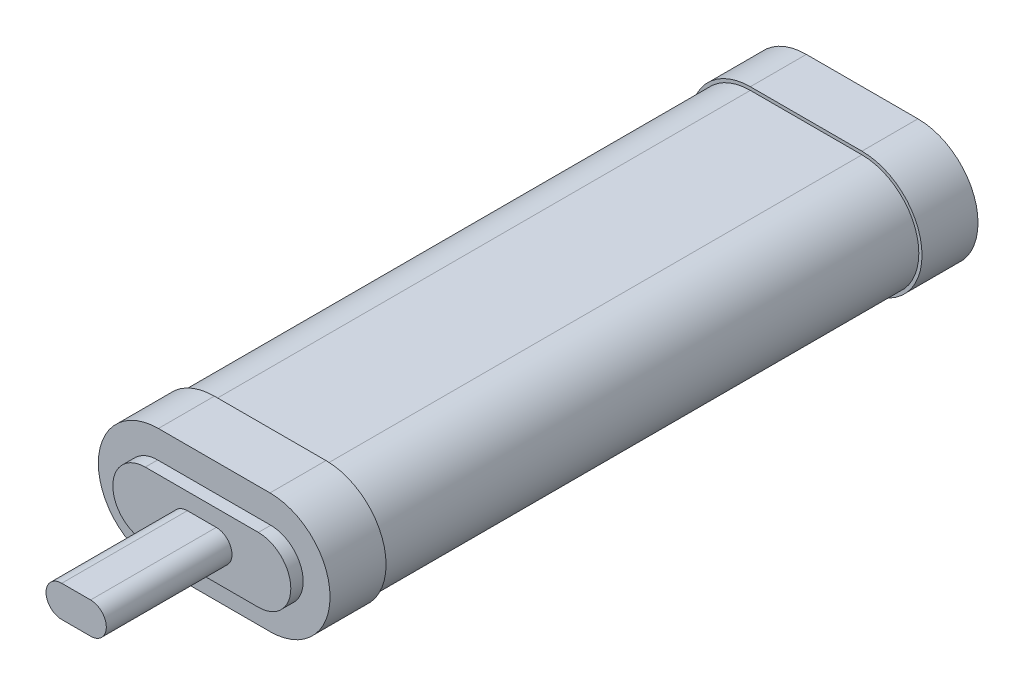
ISO-10303-21;
HEADER;
FILE_DESCRIPTION(('STEP AP214'),'2;1');
FILE_NAME('part.step','',(''),(''),'','','');
FILE_SCHEMA(('AUTOMOTIVE_DESIGN { 1 0 10303 214 1 1 1 1 }'));
ENDSEC;
DATA;
#1=APPLICATION_CONTEXT('core data for automotive mechanical design processes');
#2=APPLICATION_PROTOCOL_DEFINITION('international standard','automotive_design',2000,#1);
#3=PRODUCT_CONTEXT('',#1,'mechanical');
#4=PRODUCT('Part','Part','',(#3));
#5=PRODUCT_RELATED_PRODUCT_CATEGORY('part','',(#4));
#6=PRODUCT_DEFINITION_FORMATION('','',#4);
#7=PRODUCT_DEFINITION_CONTEXT('part definition',#1,'design');
#8=PRODUCT_DEFINITION('design','',#6,#7);
#9=PRODUCT_DEFINITION_SHAPE('','',#8);
#10=(LENGTH_UNIT() NAMED_UNIT(*) SI_UNIT(.MILLI.,.METRE.));
#11=(NAMED_UNIT(*) PLANE_ANGLE_UNIT() SI_UNIT($,.RADIAN.));
#12=(NAMED_UNIT(*) SI_UNIT($,.STERADIAN.) SOLID_ANGLE_UNIT());
#13=UNCERTAINTY_MEASURE_WITH_UNIT(LENGTH_MEASURE(1.E-05),#10,'distance_accuracy_value','');
#14=(GEOMETRIC_REPRESENTATION_CONTEXT(3) GLOBAL_UNCERTAINTY_ASSIGNED_CONTEXT((#13)) GLOBAL_UNIT_ASSIGNED_CONTEXT((#10,
#11,#12)) REPRESENTATION_CONTEXT('',''));
#15=CARTESIAN_POINT('',(0.,0.,0.));
#16=DIRECTION('',(0.,0.,1.));
#17=DIRECTION('',(1.,0.,0.));
#18=AXIS2_PLACEMENT_3D('',#15,#16,#17);
#19=CARTESIAN_POINT('',(-11.1,0.,64.45));
#20=DIRECTION('',(0.,0.,-1.));
#21=DIRECTION('',(-1.,0.,0.));
#22=AXIS2_PLACEMENT_3D('',#19,#20,#21);
#23=CYLINDRICAL_SURFACE('',#22,11.315);
#24=CARTESIAN_POINT('',(-11.1,0.,-53.31));
#25=DIRECTION('',(0.,0.,-1.));
#26=DIRECTION('',(-1.,0.,0.));
#27=AXIS2_PLACEMENT_3D('',#24,#25,#26);
#28=CIRCLE('',#27,11.315);
#29=CARTESIAN_POINT('',(-11.1,-11.315,-53.31));
#30=VERTEX_POINT('',#29);
#31=CARTESIAN_POINT('',(-11.1,11.315,-53.31));
#32=VERTEX_POINT('',#31);
#33=EDGE_CURVE('E267',#30,#32,#28,.T.);
#34=ORIENTED_EDGE('',*,*,#33,.F.);
#35=DIRECTION('',(0.,0.,-1.));
#36=VECTOR('',#35,1.);
#37=CARTESIAN_POINT('',(-11.1,-11.315,64.45));
#38=LINE('',#37,#36);
#39=CARTESIAN_POINT('',(-11.1,-11.315,53.31));
#40=VERTEX_POINT('',#39);
#41=EDGE_CURVE('E319',#40,#30,#38,.T.);
#42=ORIENTED_EDGE('',*,*,#41,.F.);
#43=CARTESIAN_POINT('',(-11.1,0.,53.31));
#44=DIRECTION('',(0.,0.,1.));
#45=DIRECTION('',(1.,0.,0.));
#46=AXIS2_PLACEMENT_3D('',#43,#44,#45);
#47=CIRCLE('',#46,11.315);
#48=CARTESIAN_POINT('',(-11.1,11.315,53.31));
#49=VERTEX_POINT('',#48);
#50=EDGE_CURVE('E308',#49,#40,#47,.T.);
#51=ORIENTED_EDGE('',*,*,#50,.F.);
#52=DIRECTION('',(0.,0.,-1.));
#53=VECTOR('',#52,1.);
#54=CARTESIAN_POINT('',(-11.1,11.315,64.45));
#55=LINE('',#54,#53);
#56=EDGE_CURVE('E311',#49,#32,#55,.T.);
#57=ORIENTED_EDGE('',*,*,#56,.T.);
#58=EDGE_LOOP('',(#34,#42,#51,#57));
#59=FACE_BOUND('',#58,.T.);
#60=ADVANCED_FACE('F34',(#59),#23,.T.);
#61=CARTESIAN_POINT('',(-11.1,-11.315,64.45));
#62=DIRECTION('',(0.,1.,0.));
#63=DIRECTION('',(-1.,0.,0.));
#64=AXIS2_PLACEMENT_3D('',#61,#62,#63);
#65=PLANE('',#64);
#66=DIRECTION('',(-1.,0.,0.));
#67=VECTOR('',#66,1.);
#68=CARTESIAN_POINT('',(-11.1,-11.315,-53.31));
#69=LINE('',#68,#67);
#70=CARTESIAN_POINT('',(11.1,-11.315,-53.31));
#71=VERTEX_POINT('',#70);
#72=EDGE_CURVE('E264',#71,#30,#69,.T.);
#73=ORIENTED_EDGE('',*,*,#72,.F.);
#74=DIRECTION('',(0.,0.,-1.));
#75=VECTOR('',#74,1.);
#76=CARTESIAN_POINT('',(11.1,-11.315,64.45));
#77=LINE('',#76,#75);
#78=CARTESIAN_POINT('',(11.1,-11.315,53.31));
#79=VERTEX_POINT('',#78);
#80=EDGE_CURVE('E316',#79,#71,#77,.T.);
#81=ORIENTED_EDGE('',*,*,#80,.F.);
#82=DIRECTION('',(1.,0.,0.));
#83=VECTOR('',#82,1.);
#84=CARTESIAN_POINT('',(-11.1,-11.315,53.31));
#85=LINE('',#84,#83);
#86=EDGE_CURVE('E305',#40,#79,#85,.T.);
#87=ORIENTED_EDGE('',*,*,#86,.F.);
#88=ORIENTED_EDGE('',*,*,#41,.T.);
#89=EDGE_LOOP('',(#73,#81,#87,#88));
#90=FACE_BOUND('',#89,.T.);
#91=ADVANCED_FACE('F337',(#90),#65,.F.);
#92=CARTESIAN_POINT('',(11.1,0.,64.45));
#93=DIRECTION('',(0.,0.,-1.));
#94=DIRECTION('',(-1.,0.,0.));
#95=AXIS2_PLACEMENT_3D('',#92,#93,#94);
#96=CYLINDRICAL_SURFACE('',#95,11.315);
#97=CARTESIAN_POINT('',(11.1,0.,-53.31));
#98=DIRECTION('',(0.,0.,-1.));
#99=DIRECTION('',(-1.,0.,0.));
#100=AXIS2_PLACEMENT_3D('',#97,#98,#99);
#101=CIRCLE('',#100,11.315);
#102=CARTESIAN_POINT('',(11.1,11.315,-53.31));
#103=VERTEX_POINT('',#102);
#104=EDGE_CURVE('E253',#103,#71,#101,.T.);
#105=ORIENTED_EDGE('',*,*,#104,.F.);
#106=DIRECTION('',(0.,0.,-1.));
#107=VECTOR('',#106,1.);
#108=CARTESIAN_POINT('',(11.1,11.315,64.45));
#109=LINE('',#108,#107);
#110=CARTESIAN_POINT('',(11.1,11.315,53.31));
#111=VERTEX_POINT('',#110);
#112=EDGE_CURVE('E314',#111,#103,#109,.T.);
#113=ORIENTED_EDGE('',*,*,#112,.F.);
#114=CARTESIAN_POINT('',(11.1,0.,53.31));
#115=DIRECTION('',(0.,0.,1.));
#116=DIRECTION('',(1.,0.,0.));
#117=AXIS2_PLACEMENT_3D('',#114,#115,#116);
#118=CIRCLE('',#117,11.315);
#119=EDGE_CURVE('E297',#79,#111,#118,.T.);
#120=ORIENTED_EDGE('',*,*,#119,.F.);
#121=ORIENTED_EDGE('',*,*,#80,.T.);
#122=EDGE_LOOP('',(#105,#113,#120,#121));
#123=FACE_BOUND('',#122,.T.);
#124=ADVANCED_FACE('F330',(#123),#96,.T.);
#125=CARTESIAN_POINT('',(-11.1,11.315,64.45));
#126=DIRECTION('',(0.,-1.,0.));
#127=DIRECTION('',(1.,0.,0.));
#128=AXIS2_PLACEMENT_3D('',#125,#126,#127);
#129=PLANE('',#128);
#130=DIRECTION('',(1.,0.,0.));
#131=VECTOR('',#130,1.);
#132=CARTESIAN_POINT('',(-11.1,11.315,-53.31));
#133=LINE('',#132,#131);
#134=EDGE_CURVE('E12',#32,#103,#133,.T.);
#135=ORIENTED_EDGE('',*,*,#134,.F.);
#136=ORIENTED_EDGE('',*,*,#56,.F.);
#137=DIRECTION('',(-1.,0.,0.));
#138=VECTOR('',#137,1.);
#139=CARTESIAN_POINT('',(-11.1,11.315,53.31));
#140=LINE('',#139,#138);
#141=EDGE_CURVE('E41',#111,#49,#140,.T.);
#142=ORIENTED_EDGE('',*,*,#141,.F.);
#143=ORIENTED_EDGE('',*,*,#112,.T.);
#144=EDGE_LOOP('',(#135,#136,#142,#143));
#145=FACE_BOUND('',#144,.T.);
#146=ADVANCED_FACE('F327',(#145),#129,.F.);
#147=CARTESIAN_POINT('',(-11.1,0.,53.31));
#148=DIRECTION('',(0.,0.,1.));
#149=DIRECTION('',(1.,0.,0.));
#150=AXIS2_PLACEMENT_3D('',#147,#148,#149);
#151=PLANE('',#150);
#152=CARTESIAN_POINT('',(-11.1,0.,53.31));
#153=DIRECTION('',(0.,0.,1.));
#154=DIRECTION('',(1.,0.,0.));
#155=AXIS2_PLACEMENT_3D('',#152,#153,#154);
#156=CIRCLE('',#155,11.95);
#157=CARTESIAN_POINT('',(-11.1,11.95,53.31));
#158=VERTEX_POINT('',#157);
#159=CARTESIAN_POINT('',(-11.1,-11.95,53.31));
#160=VERTEX_POINT('',#159);
#161=EDGE_CURVE('E271',#158,#160,#156,.T.);
#162=ORIENTED_EDGE('',*,*,#161,.F.);
#163=DIRECTION('',(-1.,0.,0.));
#164=VECTOR('',#163,1.);
#165=CARTESIAN_POINT('',(11.1,11.95,53.31));
#166=LINE('',#165,#164);
#167=CARTESIAN_POINT('',(11.1,11.95,53.31));
#168=VERTEX_POINT('',#167);
#169=EDGE_CURVE('E281',#168,#158,#166,.T.);
#170=ORIENTED_EDGE('',*,*,#169,.F.);
#171=CARTESIAN_POINT('',(11.1,0.,53.31));
#172=DIRECTION('',(0.,0.,1.));
#173=DIRECTION('',(1.,0.,0.));
#174=AXIS2_PLACEMENT_3D('',#171,#172,#173);
#175=CIRCLE('',#174,11.95);
#176=CARTESIAN_POINT('',(11.1,-11.95,53.31));
#177=VERTEX_POINT('',#176);
#178=EDGE_CURVE('E278',#177,#168,#175,.T.);
#179=ORIENTED_EDGE('',*,*,#178,.F.);
#180=DIRECTION('',(1.,0.,0.));
#181=VECTOR('',#180,1.);
#182=CARTESIAN_POINT('',(-11.1,-11.95,53.31));
#183=LINE('',#182,#181);
#184=EDGE_CURVE('E274',#160,#177,#183,.T.);
#185=ORIENTED_EDGE('',*,*,#184,.F.);
#186=EDGE_LOOP('',(#162,#170,#179,#185));
#187=FACE_BOUND('',#186,.T.);
#188=ORIENTED_EDGE('',*,*,#141,.T.);
#189=ORIENTED_EDGE('',*,*,#50,.T.);
#190=ORIENTED_EDGE('',*,*,#86,.T.);
#191=ORIENTED_EDGE('',*,*,#119,.T.);
#192=EDGE_LOOP('',(#188,#189,#190,#191));
#193=FACE_BOUND('',#192,.T.);
#194=ADVANCED_FACE('F323',(#187,#193),#151,.F.);
#195=CARTESIAN_POINT('',(-11.1,0.,53.31));
#196=DIRECTION('',(0.,0.,1.));
#197=DIRECTION('',(1.,0.,0.));
#198=AXIS2_PLACEMENT_3D('',#195,#196,#197);
#199=CYLINDRICAL_SURFACE('',#198,11.95);
#200=CARTESIAN_POINT('',(-11.1,0.,64.45));
#201=DIRECTION('',(0.,0.,1.));
#202=DIRECTION('',(1.,0.,0.));
#203=AXIS2_PLACEMENT_3D('',#200,#201,#202);
#204=CIRCLE('',#203,11.95);
#205=CARTESIAN_POINT('',(-11.1,11.95,64.45));
#206=VERTEX_POINT('',#205);
#207=CARTESIAN_POINT('',(-11.1,-11.95,64.45));
#208=VERTEX_POINT('',#207);
#209=EDGE_CURVE('E270',#206,#208,#204,.T.);
#210=ORIENTED_EDGE('',*,*,#209,.F.);
#211=DIRECTION('',(0.,0.,1.));
#212=VECTOR('',#211,1.);
#213=CARTESIAN_POINT('',(-11.1,11.95,53.31));
#214=LINE('',#213,#212);
#215=EDGE_CURVE('E295',#158,#206,#214,.T.);
#216=ORIENTED_EDGE('',*,*,#215,.F.);
#217=ORIENTED_EDGE('',*,*,#161,.T.);
#218=DIRECTION('',(0.,0.,1.));
#219=VECTOR('',#218,1.);
#220=CARTESIAN_POINT('',(-11.1,-11.95,53.31));
#221=LINE('',#220,#219);
#222=EDGE_CURVE('E284',#160,#208,#221,.T.);
#223=ORIENTED_EDGE('',*,*,#222,.T.);
#224=EDGE_LOOP('',(#210,#216,#217,#223));
#225=FACE_BOUND('',#224,.T.);
#226=ADVANCED_FACE('F358',(#225),#199,.T.);
#227=CARTESIAN_POINT('',(11.1,11.95,53.31));
#228=DIRECTION('',(0.,1.,0.));
#229=DIRECTION('',(-1.,0.,0.));
#230=AXIS2_PLACEMENT_3D('',#227,#228,#229);
#231=PLANE('',#230);
#232=DIRECTION('',(-1.,0.,0.));
#233=VECTOR('',#232,1.);
#234=CARTESIAN_POINT('',(11.1,11.95,64.45));
#235=LINE('',#234,#233);
#236=CARTESIAN_POINT('',(11.1,11.95,64.45));
#237=VERTEX_POINT('',#236);
#238=EDGE_CURVE('E275',#237,#206,#235,.T.);
#239=ORIENTED_EDGE('',*,*,#238,.F.);
#240=DIRECTION('',(0.,0.,1.));
#241=VECTOR('',#240,1.);
#242=CARTESIAN_POINT('',(11.1,11.95,53.31));
#243=LINE('',#242,#241);
#244=EDGE_CURVE('E298',#168,#237,#243,.T.);
#245=ORIENTED_EDGE('',*,*,#244,.F.);
#246=ORIENTED_EDGE('',*,*,#169,.T.);
#247=ORIENTED_EDGE('',*,*,#215,.T.);
#248=EDGE_LOOP('',(#239,#245,#246,#247));
#249=FACE_BOUND('',#248,.T.);
#250=ADVANCED_FACE('F361',(#249),#231,.T.);
#251=CARTESIAN_POINT('',(11.1,0.,53.31));
#252=DIRECTION('',(0.,0.,1.));
#253=DIRECTION('',(1.,0.,0.));
#254=AXIS2_PLACEMENT_3D('',#251,#252,#253);
#255=CYLINDRICAL_SURFACE('',#254,11.95);
#256=CARTESIAN_POINT('',(11.1,0.,64.45));
#257=DIRECTION('',(0.,0.,1.));
#258=DIRECTION('',(1.,0.,0.));
#259=AXIS2_PLACEMENT_3D('',#256,#257,#258);
#260=CIRCLE('',#259,11.95);
#261=CARTESIAN_POINT('',(11.1,-11.95,64.45));
#262=VERTEX_POINT('',#261);
#263=EDGE_CURVE('E290',#262,#237,#260,.T.);
#264=ORIENTED_EDGE('',*,*,#263,.F.);
#265=DIRECTION('',(0.,0.,1.));
#266=VECTOR('',#265,1.);
#267=CARTESIAN_POINT('',(11.1,-11.95,53.31));
#268=LINE('',#267,#266);
#269=EDGE_CURVE('E300',#177,#262,#268,.T.);
#270=ORIENTED_EDGE('',*,*,#269,.F.);
#271=ORIENTED_EDGE('',*,*,#178,.T.);
#272=ORIENTED_EDGE('',*,*,#244,.T.);
#273=EDGE_LOOP('',(#264,#270,#271,#272));
#274=FACE_BOUND('',#273,.T.);
#275=ADVANCED_FACE('F365',(#274),#255,.T.);
#276=CARTESIAN_POINT('',(-11.1,-11.95,53.31));
#277=DIRECTION('',(0.,-1.,0.));
#278=DIRECTION('',(1.,0.,0.));
#279=AXIS2_PLACEMENT_3D('',#276,#277,#278);
#280=PLANE('',#279);
#281=DIRECTION('',(1.,0.,0.));
#282=VECTOR('',#281,1.);
#283=CARTESIAN_POINT('',(-11.1,-11.95,64.45));
#284=LINE('',#283,#282);
#285=EDGE_CURVE('E287',#208,#262,#284,.T.);
#286=ORIENTED_EDGE('',*,*,#285,.F.);
#287=ORIENTED_EDGE('',*,*,#222,.F.);
#288=ORIENTED_EDGE('',*,*,#184,.T.);
#289=ORIENTED_EDGE('',*,*,#269,.T.);
#290=EDGE_LOOP('',(#286,#287,#288,#289));
#291=FACE_BOUND('',#290,.T.);
#292=ADVANCED_FACE('F356',(#291),#280,.T.);
#293=CARTESIAN_POINT('',(-11.1,0.,64.45));
#294=DIRECTION('',(0.,0.,1.));
#295=DIRECTION('',(1.,0.,0.));
#296=AXIS2_PLACEMENT_3D('',#293,#294,#295);
#297=PLANE('',#296);
#298=CARTESIAN_POINT('',(-11.25,0.,64.45));
#299=DIRECTION('',(0.,0.,1.));
#300=DIRECTION('',(1.,0.,0.));
#301=AXIS2_PLACEMENT_3D('',#298,#299,#300);
#302=CIRCLE('',#301,6.45);
#303=CARTESIAN_POINT('',(-11.25,6.45,64.45));
#304=VERTEX_POINT('',#303);
#305=CARTESIAN_POINT('',(-11.25,-6.45,64.45));
#306=VERTEX_POINT('',#305);
#307=EDGE_CURVE('E193',#304,#306,#302,.T.);
#308=ORIENTED_EDGE('',*,*,#307,.F.);
#309=DIRECTION('',(-1.,0.,0.));
#310=VECTOR('',#309,1.);
#311=CARTESIAN_POINT('',(-11.25,6.45,64.45));
#312=LINE('',#311,#310);
#313=CARTESIAN_POINT('',(11.25,6.45,64.45));
#314=VERTEX_POINT('',#313);
#315=EDGE_CURVE('E199',#314,#304,#312,.T.);
#316=ORIENTED_EDGE('',*,*,#315,.F.);
#317=CARTESIAN_POINT('',(11.25,0.,64.45));
#318=DIRECTION('',(0.,0.,1.));
#319=DIRECTION('',(1.,0.,0.));
#320=AXIS2_PLACEMENT_3D('',#317,#318,#319);
#321=CIRCLE('',#320,6.45);
#322=CARTESIAN_POINT('',(11.25,-6.45,64.45));
#323=VERTEX_POINT('',#322);
#324=EDGE_CURVE('E204',#323,#314,#321,.T.);
#325=ORIENTED_EDGE('',*,*,#324,.F.);
#326=DIRECTION('',(1.,0.,0.));
#327=VECTOR('',#326,1.);
#328=CARTESIAN_POINT('',(-11.25,-6.45,64.45));
#329=LINE('',#328,#327);
#330=EDGE_CURVE('E208',#306,#323,#329,.T.);
#331=ORIENTED_EDGE('',*,*,#330,.F.);
#332=EDGE_LOOP('',(#308,#316,#325,#331));
#333=FACE_BOUND('',#332,.T.);
#334=ORIENTED_EDGE('',*,*,#209,.T.);
#335=ORIENTED_EDGE('',*,*,#285,.T.);
#336=ORIENTED_EDGE('',*,*,#263,.T.);
#337=ORIENTED_EDGE('',*,*,#238,.T.);
#338=EDGE_LOOP('',(#334,#335,#336,#337));
#339=FACE_BOUND('',#338,.T.);
#340=ADVANCED_FACE('F353',(#333,#339),#297,.T.);
#341=CARTESIAN_POINT('',(-11.1,0.,-53.31));
#342=DIRECTION('',(0.,0.,-1.));
#343=DIRECTION('',(1.,0.,0.));
#344=AXIS2_PLACEMENT_3D('',#341,#342,#343);
#345=PLANE('',#344);
#346=CARTESIAN_POINT('',(-11.1,0.,-53.31));
#347=DIRECTION('',(0.,0.,1.));
#348=DIRECTION('',(1.,0.,0.));
#349=AXIS2_PLACEMENT_3D('',#346,#347,#348);
#350=CIRCLE('',#349,11.95);
#351=CARTESIAN_POINT('',(-11.1,11.95,-53.31));
#352=VERTEX_POINT('',#351);
#353=CARTESIAN_POINT('',(-11.1,-11.95,-53.31));
#354=VERTEX_POINT('',#353);
#355=EDGE_CURVE('E232',#352,#354,#350,.T.);
#356=ORIENTED_EDGE('',*,*,#355,.T.);
#357=DIRECTION('',(1.,0.,0.));
#358=VECTOR('',#357,1.);
#359=CARTESIAN_POINT('',(-11.1,-11.95,-53.31));
#360=LINE('',#359,#358);
#361=CARTESIAN_POINT('',(11.1,-11.95,-53.31));
#362=VERTEX_POINT('',#361);
#363=EDGE_CURVE('E240',#354,#362,#360,.T.);
#364=ORIENTED_EDGE('',*,*,#363,.T.);
#365=CARTESIAN_POINT('',(11.1,0.,-53.31));
#366=DIRECTION('',(0.,0.,1.));
#367=DIRECTION('',(1.,0.,0.));
#368=AXIS2_PLACEMENT_3D('',#365,#366,#367);
#369=CIRCLE('',#368,11.95);
#370=CARTESIAN_POINT('',(11.1,11.95,-53.31));
#371=VERTEX_POINT('',#370);
#372=EDGE_CURVE('E238',#362,#371,#369,.T.);
#373=ORIENTED_EDGE('',*,*,#372,.T.);
#374=DIRECTION('',(-1.,0.,0.));
#375=VECTOR('',#374,1.);
#376=CARTESIAN_POINT('',(11.1,11.95,-53.31));
#377=LINE('',#376,#375);
#378=EDGE_CURVE('E235',#371,#352,#377,.T.);
#379=ORIENTED_EDGE('',*,*,#378,.T.);
#380=EDGE_LOOP('',(#356,#364,#373,#379));
#381=FACE_BOUND('',#380,.T.);
#382=ORIENTED_EDGE('',*,*,#72,.T.);
#383=ORIENTED_EDGE('',*,*,#33,.T.);
#384=ORIENTED_EDGE('',*,*,#134,.T.);
#385=ORIENTED_EDGE('',*,*,#104,.T.);
#386=EDGE_LOOP('',(#382,#383,#384,#385));
#387=FACE_BOUND('',#386,.T.);
#388=ADVANCED_FACE('F333',(#381,#387),#345,.F.);
#389=CARTESIAN_POINT('',(-11.1,0.,-53.31));
#390=DIRECTION('',(0.,0.,-1.));
#391=DIRECTION('',(-1.,0.,0.));
#392=AXIS2_PLACEMENT_3D('',#389,#390,#391);
#393=CYLINDRICAL_SURFACE('',#392,11.95);
#394=CARTESIAN_POINT('',(-11.1,0.,-64.45));
#395=DIRECTION('',(0.,0.,1.));
#396=DIRECTION('',(1.,0.,0.));
#397=AXIS2_PLACEMENT_3D('',#394,#395,#396);
#398=CIRCLE('',#397,11.95);
#399=CARTESIAN_POINT('',(-11.1,11.95,-64.45));
#400=VERTEX_POINT('',#399);
#401=CARTESIAN_POINT('',(-11.1,-11.95,-64.45));
#402=VERTEX_POINT('',#401);
#403=EDGE_CURVE('E217',#400,#402,#398,.T.);
#404=ORIENTED_EDGE('',*,*,#403,.T.);
#405=DIRECTION('',(0.,0.,-1.));
#406=VECTOR('',#405,1.);
#407=CARTESIAN_POINT('',(-11.1,-11.95,-53.31));
#408=LINE('',#407,#406);
#409=EDGE_CURVE('E250',#354,#402,#408,.T.);
#410=ORIENTED_EDGE('',*,*,#409,.F.);
#411=ORIENTED_EDGE('',*,*,#355,.F.);
#412=DIRECTION('',(0.,0.,-1.));
#413=VECTOR('',#412,1.);
#414=CARTESIAN_POINT('',(-11.1,11.95,-53.31));
#415=LINE('',#414,#413);
#416=EDGE_CURVE('E242',#352,#400,#415,.T.);
#417=ORIENTED_EDGE('',*,*,#416,.T.);
#418=EDGE_LOOP('',(#404,#410,#411,#417));
#419=FACE_BOUND('',#418,.T.);
#420=ADVANCED_FACE('F376',(#419),#393,.T.);
#421=CARTESIAN_POINT('',(-11.1,-11.95,-53.31));
#422=DIRECTION('',(0.,1.,0.));
#423=DIRECTION('',(-1.,0.,0.));
#424=AXIS2_PLACEMENT_3D('',#421,#422,#423);
#425=PLANE('',#424);
#426=DIRECTION('',(1.,0.,0.));
#427=VECTOR('',#426,1.);
#428=CARTESIAN_POINT('',(-11.1,-11.95,-64.45));
#429=LINE('',#428,#427);
#430=CARTESIAN_POINT('',(11.1,-11.95,-64.45));
#431=VERTEX_POINT('',#430);
#432=EDGE_CURVE('E236',#402,#431,#429,.T.);
#433=ORIENTED_EDGE('',*,*,#432,.T.);
#434=DIRECTION('',(0.,0.,-1.));
#435=VECTOR('',#434,1.);
#436=CARTESIAN_POINT('',(11.1,-11.95,-53.31));
#437=LINE('',#436,#435);
#438=EDGE_CURVE('E254',#362,#431,#437,.T.);
#439=ORIENTED_EDGE('',*,*,#438,.F.);
#440=ORIENTED_EDGE('',*,*,#363,.F.);
#441=ORIENTED_EDGE('',*,*,#409,.T.);
#442=EDGE_LOOP('',(#433,#439,#440,#441));
#443=FACE_BOUND('',#442,.T.);
#444=ADVANCED_FACE('F379',(#443),#425,.F.);
#445=CARTESIAN_POINT('',(11.1,0.,-53.31));
#446=DIRECTION('',(0.,0.,-1.));
#447=DIRECTION('',(-1.,0.,0.));
#448=AXIS2_PLACEMENT_3D('',#445,#446,#447);
#449=CYLINDRICAL_SURFACE('',#448,11.95);
#450=CARTESIAN_POINT('',(11.1,0.,-64.45));
#451=DIRECTION('',(0.,0.,1.));
#452=DIRECTION('',(1.,0.,0.));
#453=AXIS2_PLACEMENT_3D('',#450,#451,#452);
#454=CIRCLE('',#453,11.95);
#455=CARTESIAN_POINT('',(11.1,11.95,-64.45));
#456=VERTEX_POINT('',#455);
#457=EDGE_CURVE('E247',#431,#456,#454,.T.);
#458=ORIENTED_EDGE('',*,*,#457,.T.);
#459=DIRECTION('',(0.,0.,-1.));
#460=VECTOR('',#459,1.);
#461=CARTESIAN_POINT('',(11.1,11.95,-53.31));
#462=LINE('',#461,#460);
#463=EDGE_CURVE('E257',#371,#456,#462,.T.);
#464=ORIENTED_EDGE('',*,*,#463,.F.);
#465=ORIENTED_EDGE('',*,*,#372,.F.);
#466=ORIENTED_EDGE('',*,*,#438,.T.);
#467=EDGE_LOOP('',(#458,#464,#465,#466));
#468=FACE_BOUND('',#467,.T.);
#469=ADVANCED_FACE('F383',(#468),#449,.T.);
#470=CARTESIAN_POINT('',(11.1,11.95,-53.31));
#471=DIRECTION('',(0.,-1.,0.));
#472=DIRECTION('',(1.,0.,0.));
#473=AXIS2_PLACEMENT_3D('',#470,#471,#472);
#474=PLANE('',#473);
#475=DIRECTION('',(-1.,0.,0.));
#476=VECTOR('',#475,1.);
#477=CARTESIAN_POINT('',(11.1,11.95,-64.45));
#478=LINE('',#477,#476);
#479=EDGE_CURVE('E245',#456,#400,#478,.T.);
#480=ORIENTED_EDGE('',*,*,#479,.T.);
#481=ORIENTED_EDGE('',*,*,#416,.F.);
#482=ORIENTED_EDGE('',*,*,#378,.F.);
#483=ORIENTED_EDGE('',*,*,#463,.T.);
#484=EDGE_LOOP('',(#480,#481,#482,#483));
#485=FACE_BOUND('',#484,.T.);
#486=ADVANCED_FACE('F351',(#485),#474,.F.);
#487=CARTESIAN_POINT('',(-11.1,0.,-64.45));
#488=DIRECTION('',(0.,0.,1.));
#489=DIRECTION('',(1.,0.,0.));
#490=AXIS2_PLACEMENT_3D('',#487,#488,#489);
#491=PLANE('',#490);
#492=ORIENTED_EDGE('',*,*,#403,.F.);
#493=ORIENTED_EDGE('',*,*,#479,.F.);
#494=ORIENTED_EDGE('',*,*,#457,.F.);
#495=ORIENTED_EDGE('',*,*,#432,.F.);
#496=EDGE_LOOP('',(#492,#493,#494,#495));
#497=FACE_BOUND('',#496,.T.);
#498=ADVANCED_FACE('F347',(#497),#491,.F.);
#499=CARTESIAN_POINT('',(-11.25,0.,235.947181423243));
#500=DIRECTION('',(0.,0.,-1.));
#501=DIRECTION('',(-1.,0.,0.));
#502=AXIS2_PLACEMENT_3D('',#499,#500,#501);
#503=CYLINDRICAL_SURFACE('',#502,6.45);
#504=CARTESIAN_POINT('',(-11.25,0.,66.91));
#505=DIRECTION('',(0.,0.,1.));
#506=DIRECTION('',(1.,0.,0.));
#507=AXIS2_PLACEMENT_3D('',#504,#505,#506);
#508=CIRCLE('',#507,6.45);
#509=CARTESIAN_POINT('',(-11.25,6.45,66.91));
#510=VERTEX_POINT('',#509);
#511=CARTESIAN_POINT('',(-11.25,-6.45,66.91));
#512=VERTEX_POINT('',#511);
#513=EDGE_CURVE('E221',#510,#512,#508,.T.);
#514=ORIENTED_EDGE('',*,*,#513,.F.);
#515=DIRECTION('',(0.,0.,-1.));
#516=VECTOR('',#515,1.);
#517=CARTESIAN_POINT('',(-11.25,6.45,235.947181423243));
#518=LINE('',#517,#516);
#519=EDGE_CURVE('E190',#510,#304,#518,.T.);
#520=ORIENTED_EDGE('',*,*,#519,.T.);
#521=ORIENTED_EDGE('',*,*,#307,.T.);
#522=DIRECTION('',(0.,0.,-1.));
#523=VECTOR('',#522,1.);
#524=CARTESIAN_POINT('',(-11.25,-6.45,235.947181423243));
#525=LINE('',#524,#523);
#526=EDGE_CURVE('E211',#512,#306,#525,.T.);
#527=ORIENTED_EDGE('',*,*,#526,.F.);
#528=EDGE_LOOP('',(#514,#520,#521,#527));
#529=FACE_BOUND('',#528,.T.);
#530=ADVANCED_FACE('F350',(#529),#503,.T.);
#531=CARTESIAN_POINT('',(-11.25,-6.45,235.947181423243));
#532=DIRECTION('',(0.,1.,0.));
#533=DIRECTION('',(-1.,0.,0.));
#534=AXIS2_PLACEMENT_3D('',#531,#532,#533);
#535=PLANE('',#534);
#536=DIRECTION('',(1.,0.,0.));
#537=VECTOR('',#536,1.);
#538=CARTESIAN_POINT('',(-11.25,-6.45,66.91));
#539=LINE('',#538,#537);
#540=CARTESIAN_POINT('',(11.25,-6.45,66.91));
#541=VERTEX_POINT('',#540);
#542=EDGE_CURVE('E218',#512,#541,#539,.T.);
#543=ORIENTED_EDGE('',*,*,#542,.F.);
#544=ORIENTED_EDGE('',*,*,#526,.T.);
#545=ORIENTED_EDGE('',*,*,#330,.T.);
#546=DIRECTION('',(0.,0.,-1.));
#547=VECTOR('',#546,1.);
#548=CARTESIAN_POINT('',(11.25,-6.45,235.947181423243));
#549=LINE('',#548,#547);
#550=EDGE_CURVE('E207',#541,#323,#549,.T.);
#551=ORIENTED_EDGE('',*,*,#550,.F.);
#552=EDGE_LOOP('',(#543,#544,#545,#551));
#553=FACE_BOUND('',#552,.T.);
#554=ADVANCED_FACE('F400',(#553),#535,.F.);
#555=CARTESIAN_POINT('',(11.25,0.,235.947181423243));
#556=DIRECTION('',(0.,0.,-1.));
#557=DIRECTION('',(-1.,0.,0.));
#558=AXIS2_PLACEMENT_3D('',#555,#556,#557);
#559=CYLINDRICAL_SURFACE('',#558,6.45);
#560=CARTESIAN_POINT('',(11.25,0.,66.91));
#561=DIRECTION('',(0.,0.,1.));
#562=DIRECTION('',(1.,0.,0.));
#563=AXIS2_PLACEMENT_3D('',#560,#561,#562);
#564=CIRCLE('',#563,6.45);
#565=CARTESIAN_POINT('',(11.25,6.45,66.91));
#566=VERTEX_POINT('',#565);
#567=EDGE_CURVE('E214',#541,#566,#564,.T.);
#568=ORIENTED_EDGE('',*,*,#567,.F.);
#569=ORIENTED_EDGE('',*,*,#550,.T.);
#570=ORIENTED_EDGE('',*,*,#324,.T.);
#571=DIRECTION('',(0.,0.,-1.));
#572=VECTOR('',#571,1.);
#573=CARTESIAN_POINT('',(11.25,6.45,235.947181423243));
#574=LINE('',#573,#572);
#575=EDGE_CURVE('E203',#566,#314,#574,.T.);
#576=ORIENTED_EDGE('',*,*,#575,.F.);
#577=EDGE_LOOP('',(#568,#569,#570,#576));
#578=FACE_BOUND('',#577,.T.);
#579=ADVANCED_FACE('F404',(#578),#559,.T.);
#580=CARTESIAN_POINT('',(-11.25,6.45,235.947181423243));
#581=DIRECTION('',(0.,-1.,0.));
#582=DIRECTION('',(1.,0.,0.));
#583=AXIS2_PLACEMENT_3D('',#580,#581,#582);
#584=PLANE('',#583);
#585=DIRECTION('',(-1.,0.,0.));
#586=VECTOR('',#585,1.);
#587=CARTESIAN_POINT('',(-11.25,6.45,66.91));
#588=LINE('',#587,#586);
#589=EDGE_CURVE('E202',#566,#510,#588,.T.);
#590=ORIENTED_EDGE('',*,*,#589,.F.);
#591=ORIENTED_EDGE('',*,*,#575,.T.);
#592=ORIENTED_EDGE('',*,*,#315,.T.);
#593=ORIENTED_EDGE('',*,*,#519,.F.);
#594=EDGE_LOOP('',(#590,#591,#592,#593));
#595=FACE_BOUND('',#594,.T.);
#596=ADVANCED_FACE('F397',(#595),#584,.F.);
#597=CARTESIAN_POINT('',(-11.1,0.,66.91));
#598=DIRECTION('',(0.,0.,1.));
#599=DIRECTION('',(1.,0.,0.));
#600=AXIS2_PLACEMENT_3D('',#597,#598,#599);
#601=PLANE('',#600);
#602=CARTESIAN_POINT('',(-2.875,0.,66.91));
#603=DIRECTION('',(0.,0.,1.));
#604=DIRECTION('',(1.,0.,0.));
#605=AXIS2_PLACEMENT_3D('',#602,#603,#604);
#606=CIRCLE('',#605,3.125);
#607=CARTESIAN_POINT('',(-2.875,3.125,66.91));
#608=VERTEX_POINT('',#607);
#609=CARTESIAN_POINT('',(-2.875,-3.125,66.91));
#610=VERTEX_POINT('',#609);
#611=EDGE_CURVE('E48',#608,#610,#606,.T.);
#612=ORIENTED_EDGE('',*,*,#611,.F.);
#613=DIRECTION('',(-1.,0.,0.));
#614=VECTOR('',#613,1.);
#615=CARTESIAN_POINT('',(-2.875,3.125,66.91));
#616=LINE('',#615,#614);
#617=CARTESIAN_POINT('',(2.875,3.125,66.91));
#618=VERTEX_POINT('',#617);
#619=EDGE_CURVE('E52',#618,#608,#616,.T.);
#620=ORIENTED_EDGE('',*,*,#619,.F.);
#621=CARTESIAN_POINT('',(2.875,0.,66.91));
#622=DIRECTION('',(0.,0.,1.));
#623=DIRECTION('',(1.,0.,0.));
#624=AXIS2_PLACEMENT_3D('',#621,#622,#623);
#625=CIRCLE('',#624,3.125);
#626=CARTESIAN_POINT('',(2.875,-3.125,66.91));
#627=VERTEX_POINT('',#626);
#628=EDGE_CURVE('E536',#627,#618,#625,.T.);
#629=ORIENTED_EDGE('',*,*,#628,.F.);
#630=DIRECTION('',(1.,0.,0.));
#631=VECTOR('',#630,1.);
#632=CARTESIAN_POINT('',(-2.875,-3.125,66.91));
#633=LINE('',#632,#631);
#634=EDGE_CURVE('E542',#610,#627,#633,.T.);
#635=ORIENTED_EDGE('',*,*,#634,.F.);
#636=EDGE_LOOP('',(#612,#620,#629,#635));
#637=FACE_BOUND('',#636,.T.);
#638=ORIENTED_EDGE('',*,*,#589,.T.);
#639=ORIENTED_EDGE('',*,*,#513,.T.);
#640=ORIENTED_EDGE('',*,*,#542,.T.);
#641=ORIENTED_EDGE('',*,*,#567,.T.);
#642=EDGE_LOOP('',(#638,#639,#640,#641));
#643=FACE_BOUND('',#642,.T.);
#644=ADVANCED_FACE('F394',(#637,#643),#601,.T.);
#645=CARTESIAN_POINT('',(-2.875,0.,91.91));
#646=DIRECTION('',(0.,0.,-1.));
#647=DIRECTION('',(-1.,0.,0.));
#648=AXIS2_PLACEMENT_3D('',#645,#646,#647);
#649=CYLINDRICAL_SURFACE('',#648,3.125);
#650=ORIENTED_EDGE('',*,*,#611,.T.);
#651=DIRECTION('',(0.,0.,-1.));
#652=VECTOR('',#651,1.);
#653=CARTESIAN_POINT('',(-2.875,-3.125,91.91));
#654=LINE('',#653,#652);
#655=CARTESIAN_POINT('',(-2.875,-3.125,91.91));
#656=VERTEX_POINT('',#655);
#657=EDGE_CURVE('E173',#656,#610,#654,.T.);
#658=ORIENTED_EDGE('',*,*,#657,.F.);
#659=CARTESIAN_POINT('',(-2.875,0.,91.91));
#660=DIRECTION('',(0.,0.,1.));
#661=DIRECTION('',(1.,0.,0.));
#662=AXIS2_PLACEMENT_3D('',#659,#660,#661);
#663=CIRCLE('',#662,3.125);
#664=CARTESIAN_POINT('',(-2.875,3.125,91.91));
#665=VERTEX_POINT('',#664);
#666=EDGE_CURVE('E179',#665,#656,#663,.T.);
#667=ORIENTED_EDGE('',*,*,#666,.F.);
#668=DIRECTION('',(0.,0.,-1.));
#669=VECTOR('',#668,1.);
#670=CARTESIAN_POINT('',(-2.875,3.125,91.91));
#671=LINE('',#670,#669);
#672=EDGE_CURVE('E534',#665,#608,#671,.T.);
#673=ORIENTED_EDGE('',*,*,#672,.T.);
#674=EDGE_LOOP('',(#650,#658,#667,#673));
#675=FACE_BOUND('',#674,.T.);
#676=ADVANCED_FACE('F189',(#675),#649,.T.);
#677=CARTESIAN_POINT('',(-2.875,-3.125,91.91));
#678=DIRECTION('',(0.,1.,0.));
#679=DIRECTION('',(-1.,0.,0.));
#680=AXIS2_PLACEMENT_3D('',#677,#678,#679);
#681=PLANE('',#680);
#682=ORIENTED_EDGE('',*,*,#634,.T.);
#683=DIRECTION('',(0.,0.,-1.));
#684=VECTOR('',#683,1.);
#685=CARTESIAN_POINT('',(2.875,-3.125,91.91));
#686=LINE('',#685,#684);
#687=CARTESIAN_POINT('',(2.875,-3.125,91.91));
#688=VERTEX_POINT('',#687);
#689=EDGE_CURVE('E175',#688,#627,#686,.T.);
#690=ORIENTED_EDGE('',*,*,#689,.F.);
#691=DIRECTION('',(1.,0.,0.));
#692=VECTOR('',#691,1.);
#693=CARTESIAN_POINT('',(-2.875,-3.125,91.91));
#694=LINE('',#693,#692);
#695=EDGE_CURVE('E168',#656,#688,#694,.T.);
#696=ORIENTED_EDGE('',*,*,#695,.F.);
#697=ORIENTED_EDGE('',*,*,#657,.T.);
#698=EDGE_LOOP('',(#682,#690,#696,#697));
#699=FACE_BOUND('',#698,.T.);
#700=ADVANCED_FACE('F171',(#699),#681,.F.);
#701=CARTESIAN_POINT('',(2.875,0.,91.91));
#702=DIRECTION('',(0.,0.,-1.));
#703=DIRECTION('',(-1.,0.,0.));
#704=AXIS2_PLACEMENT_3D('',#701,#702,#703);
#705=CYLINDRICAL_SURFACE('',#704,3.125);
#706=ORIENTED_EDGE('',*,*,#628,.T.);
#707=DIRECTION('',(0.,0.,-1.));
#708=VECTOR('',#707,1.);
#709=CARTESIAN_POINT('',(2.875,3.125,91.91));
#710=LINE('',#709,#708);
#711=CARTESIAN_POINT('',(2.875,3.125,91.91));
#712=VERTEX_POINT('',#711);
#713=EDGE_CURVE('E195',#712,#618,#710,.T.);
#714=ORIENTED_EDGE('',*,*,#713,.F.);
#715=CARTESIAN_POINT('',(2.875,0.,91.91));
#716=DIRECTION('',(0.,0.,1.));
#717=DIRECTION('',(1.,0.,0.));
#718=AXIS2_PLACEMENT_3D('',#715,#716,#717);
#719=CIRCLE('',#718,3.125);
#720=EDGE_CURVE('E178',#688,#712,#719,.T.);
#721=ORIENTED_EDGE('',*,*,#720,.F.);
#722=ORIENTED_EDGE('',*,*,#689,.T.);
#723=EDGE_LOOP('',(#706,#714,#721,#722));
#724=FACE_BOUND('',#723,.T.);
#725=ADVANCED_FACE('F416',(#724),#705,.T.);
#726=CARTESIAN_POINT('',(-2.875,3.125,91.91));
#727=DIRECTION('',(0.,-1.,0.));
#728=DIRECTION('',(1.,0.,0.));
#729=AXIS2_PLACEMENT_3D('',#726,#727,#728);
#730=PLANE('',#729);
#731=ORIENTED_EDGE('',*,*,#619,.T.);
#732=ORIENTED_EDGE('',*,*,#672,.F.);
#733=DIRECTION('',(-1.,0.,0.));
#734=VECTOR('',#733,1.);
#735=CARTESIAN_POINT('',(-2.875,3.125,91.91));
#736=LINE('',#735,#734);
#737=EDGE_CURVE('E184',#712,#665,#736,.T.);
#738=ORIENTED_EDGE('',*,*,#737,.F.);
#739=ORIENTED_EDGE('',*,*,#713,.T.);
#740=EDGE_LOOP('',(#731,#732,#738,#739));
#741=FACE_BOUND('',#740,.T.);
#742=ADVANCED_FACE('F419',(#741),#730,.F.);
#743=CARTESIAN_POINT('',(-2.875,0.,91.91));
#744=DIRECTION('',(0.,0.,1.));
#745=DIRECTION('',(1.,0.,0.));
#746=AXIS2_PLACEMENT_3D('',#743,#744,#745);
#747=PLANE('',#746);
#748=ORIENTED_EDGE('',*,*,#666,.T.);
#749=ORIENTED_EDGE('',*,*,#695,.T.);
#750=ORIENTED_EDGE('',*,*,#720,.T.);
#751=ORIENTED_EDGE('',*,*,#737,.T.);
#752=EDGE_LOOP('',(#748,#749,#750,#751));
#753=FACE_BOUND('',#752,.T.);
#754=ADVANCED_FACE('F182',(#753),#747,.T.);
#755=CLOSED_SHELL('',(#60,#91,#124,#146,#194,#226,#250,#275,#292,#340,#388,#420,#444,#469,#486,
#498,#530,#554,#579,#596,#644,#676,#700,#725,#742,#754));
#756=MANIFOLD_SOLID_BREP('B2',#755);
#757=ADVANCED_BREP_SHAPE_REPRESENTATION('',(#18,#756),#14);
#758=SHAPE_DEFINITION_REPRESENTATION(#9,#757);
ENDSEC;
END-ISO-10303-21;
